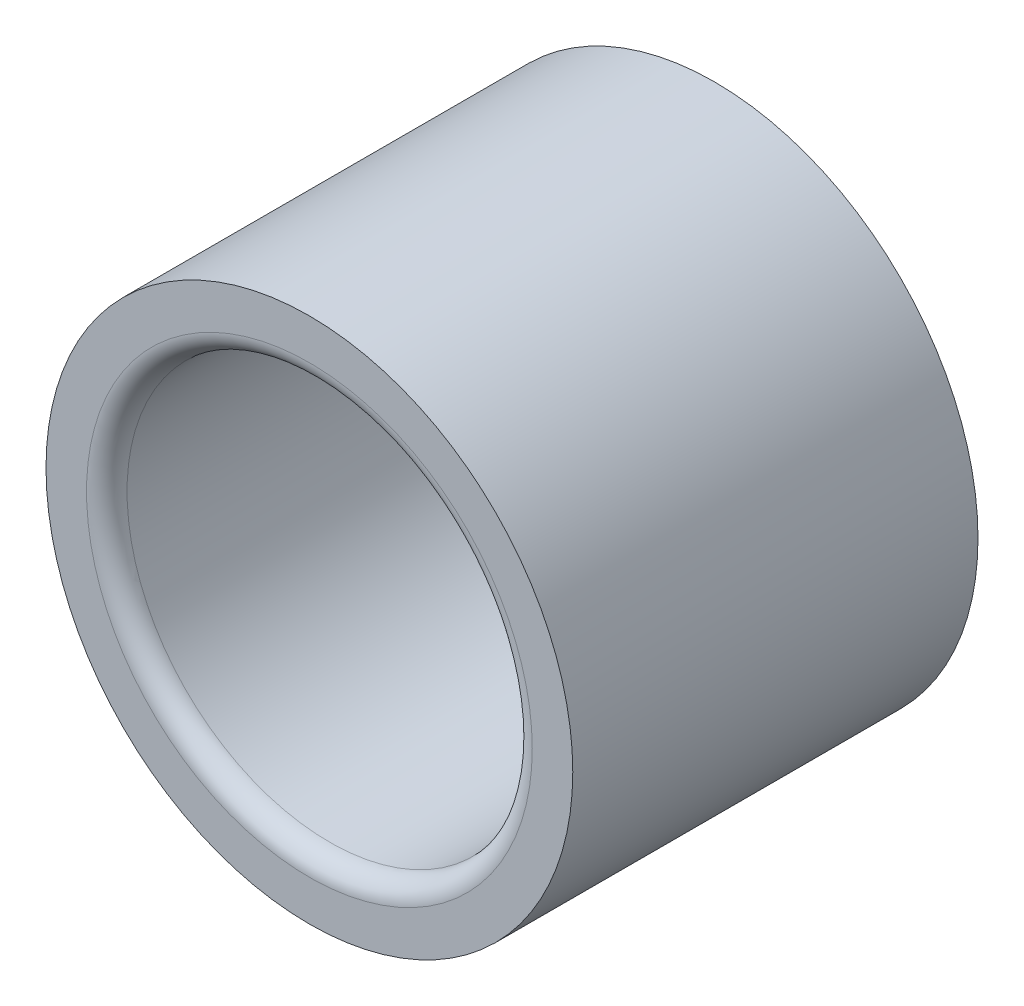
ISO-10303-21;
HEADER;
FILE_DESCRIPTION(('STEP AP214'),'2;1');
FILE_NAME('part.step','',(''),(''),'','','');
FILE_SCHEMA(('AUTOMOTIVE_DESIGN { 1 0 10303 214 1 1 1 1 }'));
ENDSEC;
DATA;
#1=APPLICATION_CONTEXT('core data for automotive mechanical design processes');
#2=APPLICATION_PROTOCOL_DEFINITION('international standard','automotive_design',2000,#1);
#3=PRODUCT_CONTEXT('',#1,'mechanical');
#4=PRODUCT('Part','Part','',(#3));
#5=PRODUCT_RELATED_PRODUCT_CATEGORY('part','',(#4));
#6=PRODUCT_DEFINITION_FORMATION('','',#4);
#7=PRODUCT_DEFINITION_CONTEXT('part definition',#1,'design');
#8=PRODUCT_DEFINITION('design','',#6,#7);
#9=PRODUCT_DEFINITION_SHAPE('','',#8);
#10=(LENGTH_UNIT() NAMED_UNIT(*) SI_UNIT(.MILLI.,.METRE.));
#11=(NAMED_UNIT(*) PLANE_ANGLE_UNIT() SI_UNIT($,.RADIAN.));
#12=(NAMED_UNIT(*) SI_UNIT($,.STERADIAN.) SOLID_ANGLE_UNIT());
#13=UNCERTAINTY_MEASURE_WITH_UNIT(LENGTH_MEASURE(1.E-05),#10,'distance_accuracy_value','');
#14=(GEOMETRIC_REPRESENTATION_CONTEXT(3) GLOBAL_UNCERTAINTY_ASSIGNED_CONTEXT((#13)) GLOBAL_UNIT_ASSIGNED_CONTEXT((#10,
#11,#12)) REPRESENTATION_CONTEXT('',''));
#15=CARTESIAN_POINT('',(0.,0.,0.));
#16=DIRECTION('',(0.,0.,1.));
#17=DIRECTION('',(1.,0.,0.));
#18=AXIS2_PLACEMENT_3D('',#15,#16,#17);
#19=CARTESIAN_POINT('',(0.,0.,20.));
#20=DIRECTION('',(0.,0.,-1.));
#21=DIRECTION('',(-1.,0.,0.));
#22=AXIS2_PLACEMENT_3D('',#19,#20,#21);
#23=CYLINDRICAL_SURFACE('',#22,13.);
#24=CARTESIAN_POINT('',(0.,0.,20.));
#25=DIRECTION('',(0.,0.,1.));
#26=DIRECTION('',(1.,0.,0.));
#27=AXIS2_PLACEMENT_3D('',#24,#25,#26);
#28=CIRCLE('',#27,13.);
#29=CARTESIAN_POINT('',(13.,0.,20.));
#30=VERTEX_POINT('',#29);
#31=EDGE_CURVE('E41',#30,#30,#28,.T.);
#32=ORIENTED_EDGE('',*,*,#31,.F.);
#33=EDGE_LOOP('',(#32));
#34=FACE_BOUND('',#33,.T.);
#35=CARTESIAN_POINT('',(0.,0.,0.));
#36=DIRECTION('',(0.,0.,1.));
#37=DIRECTION('',(1.,0.,0.));
#38=AXIS2_PLACEMENT_3D('',#35,#36,#37);
#39=CIRCLE('',#38,13.);
#40=CARTESIAN_POINT('',(13.,0.,0.));
#41=VERTEX_POINT('',#40);
#42=EDGE_CURVE('E45',#41,#41,#39,.T.);
#43=ORIENTED_EDGE('',*,*,#42,.T.);
#44=EDGE_LOOP('',(#43));
#45=FACE_BOUND('',#44,.T.);
#46=ADVANCED_FACE('F30',(#34,#45),#23,.T.);
#47=CARTESIAN_POINT('',(0.,0.,20.));
#48=DIRECTION('',(0.,0.,1.));
#49=DIRECTION('',(1.,0.,0.));
#50=AXIS2_PLACEMENT_3D('',#47,#48,#49);
#51=PLANE('',#50);
#52=CARTESIAN_POINT('',(0.,0.,20.));
#53=DIRECTION('',(0.,0.,1.));
#54=DIRECTION('',(1.,0.,0.));
#55=AXIS2_PLACEMENT_3D('',#52,#53,#54);
#56=CIRCLE('',#55,11.);
#57=CARTESIAN_POINT('',(11.,0.,20.));
#58=VERTEX_POINT('',#57);
#59=EDGE_CURVE('E10',#58,#58,#56,.F.);
#60=ORIENTED_EDGE('',*,*,#59,.T.);
#61=EDGE_LOOP('',(#60));
#62=FACE_BOUND('',#61,.T.);
#63=ORIENTED_EDGE('',*,*,#31,.T.);
#64=EDGE_LOOP('',(#63));
#65=FACE_BOUND('',#64,.T.);
#66=ADVANCED_FACE('F65',(#62,#65),#51,.T.);
#67=CARTESIAN_POINT('',(0.,0.,0.));
#68=DIRECTION('',(0.,0.,1.));
#69=DIRECTION('',(1.,0.,0.));
#70=AXIS2_PLACEMENT_3D('',#67,#68,#69);
#71=PLANE('',#70);
#72=ORIENTED_EDGE('',*,*,#42,.F.);
#73=EDGE_LOOP('',(#72));
#74=FACE_BOUND('',#73,.T.);
#75=ADVANCED_FACE('F58',(#74),#71,.F.);
#76=CARTESIAN_POINT('',(0.,0.,3.));
#77=DIRECTION('',(0.,0.,1.));
#78=DIRECTION('',(1.,0.,0.));
#79=AXIS2_PLACEMENT_3D('',#76,#77,#78);
#80=CYLINDRICAL_SURFACE('',#79,10.);
#81=CARTESIAN_POINT('',(0.,0.,19.));
#82=DIRECTION('',(0.,0.,1.));
#83=DIRECTION('',(1.,0.,0.));
#84=AXIS2_PLACEMENT_3D('',#81,#82,#83);
#85=CIRCLE('',#84,10.);
#86=CARTESIAN_POINT('',(10.,0.,19.));
#87=VERTEX_POINT('',#86);
#88=EDGE_CURVE('E37',#87,#87,#85,.T.);
#89=ORIENTED_EDGE('',*,*,#88,.T.);
#90=EDGE_LOOP('',(#89));
#91=FACE_BOUND('',#90,.T.);
#92=CARTESIAN_POINT('',(0.,0.,3.));
#93=DIRECTION('',(0.,0.,1.));
#94=DIRECTION('',(1.,0.,0.));
#95=AXIS2_PLACEMENT_3D('',#92,#93,#94);
#96=CIRCLE('',#95,10.);
#97=CARTESIAN_POINT('',(10.,0.,3.));
#98=VERTEX_POINT('',#97);
#99=EDGE_CURVE('E49',#98,#98,#96,.T.);
#100=ORIENTED_EDGE('',*,*,#99,.F.);
#101=EDGE_LOOP('',(#100));
#102=FACE_BOUND('',#101,.T.);
#103=ADVANCED_FACE('F56',(#91,#102),#80,.F.);
#104=CARTESIAN_POINT('',(0.,0.,3.));
#105=DIRECTION('',(0.,0.,1.));
#106=DIRECTION('',(1.,0.,0.));
#107=AXIS2_PLACEMENT_3D('',#104,#105,#106);
#108=PLANE('',#107);
#109=ORIENTED_EDGE('',*,*,#99,.T.);
#110=EDGE_LOOP('',(#109));
#111=FACE_BOUND('',#110,.T.);
#112=ADVANCED_FACE('F54',(#111),#108,.T.);
#113=CARTESIAN_POINT('',(0.,0.,19.));
#114=DIRECTION('',(0.,0.,1.));
#115=DIRECTION('',(1.,0.,0.));
#116=AXIS2_PLACEMENT_3D('',#113,#114,#115);
#117=TOROIDAL_SURFACE('',#116,11.,1.);
#118=ORIENTED_EDGE('',*,*,#59,.F.);
#119=EDGE_LOOP('',(#118));
#120=FACE_BOUND('',#119,.T.);
#121=ORIENTED_EDGE('',*,*,#88,.F.);
#122=EDGE_LOOP('',(#121));
#123=FACE_BOUND('',#122,.T.);
#124=ADVANCED_FACE('F32',(#120,#123),#117,.T.);
#125=CLOSED_SHELL('',(#46,#66,#75,#103,#112,#124));
#126=MANIFOLD_SOLID_BREP('B2',#125);
#127=ADVANCED_BREP_SHAPE_REPRESENTATION('',(#18,#126),#14);
#128=SHAPE_DEFINITION_REPRESENTATION(#9,#127);
ENDSEC;
END-ISO-10303-21;
